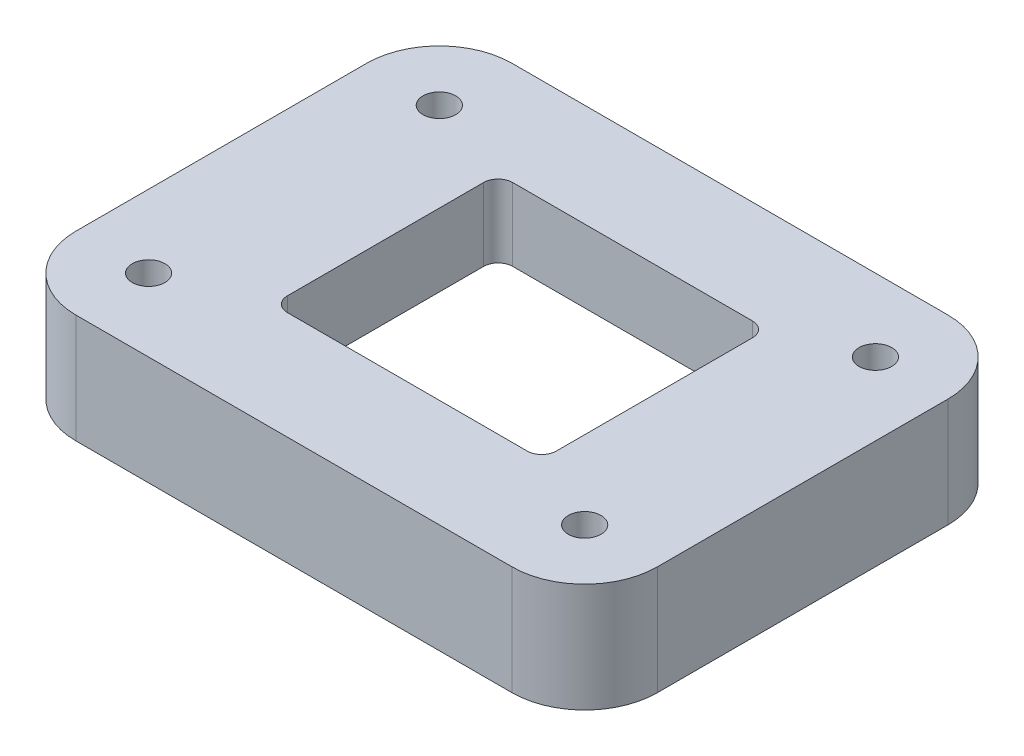
ISO-10303-21;
HEADER;
FILE_DESCRIPTION(('STEP AP214'),'2;1');
FILE_NAME('part.step','',(''),(''),'','','');
FILE_SCHEMA(('AUTOMOTIVE_DESIGN { 1 0 10303 214 1 1 1 1 }'));
ENDSEC;
DATA;
#1=APPLICATION_CONTEXT('core data for automotive mechanical design processes');
#2=APPLICATION_PROTOCOL_DEFINITION('international standard','automotive_design',2000,#1);
#3=PRODUCT_CONTEXT('',#1,'mechanical');
#4=PRODUCT('Part','Part','',(#3));
#5=PRODUCT_RELATED_PRODUCT_CATEGORY('part','',(#4));
#6=PRODUCT_DEFINITION_FORMATION('','',#4);
#7=PRODUCT_DEFINITION_CONTEXT('part definition',#1,'design');
#8=PRODUCT_DEFINITION('design','',#6,#7);
#9=PRODUCT_DEFINITION_SHAPE('','',#8);
#10=(LENGTH_UNIT() NAMED_UNIT(*) SI_UNIT(.MILLI.,.METRE.));
#11=(NAMED_UNIT(*) PLANE_ANGLE_UNIT() SI_UNIT($,.RADIAN.));
#12=(NAMED_UNIT(*) SI_UNIT($,.STERADIAN.) SOLID_ANGLE_UNIT());
#13=UNCERTAINTY_MEASURE_WITH_UNIT(LENGTH_MEASURE(1.E-05),#10,'distance_accuracy_value','');
#14=(GEOMETRIC_REPRESENTATION_CONTEXT(3) GLOBAL_UNCERTAINTY_ASSIGNED_CONTEXT((#13)) GLOBAL_UNIT_ASSIGNED_CONTEXT((#10,
#11,#12)) REPRESENTATION_CONTEXT('',''));
#15=CARTESIAN_POINT('',(0.,0.,0.));
#16=DIRECTION('',(0.,0.,1.));
#17=DIRECTION('',(1.,0.,0.));
#18=AXIS2_PLACEMENT_3D('',#15,#16,#17);
#19=CARTESIAN_POINT('',(10.,15.,50.));
#20=DIRECTION('',(0.,1.,0.));
#21=DIRECTION('',(0.,0.,1.));
#22=AXIS2_PLACEMENT_3D('',#19,#20,#21);
#23=PLANE('',#22);
#24=CARTESIAN_POINT('',(10.,15.,50.));
#25=DIRECTION('',(0.,1.,0.));
#26=DIRECTION('',(0.,0.,1.));
#27=AXIS2_PLACEMENT_3D('',#24,#25,#26);
#28=CIRCLE('',#27,2.25);
#29=CARTESIAN_POINT('',(10.,15.,52.25));
#30=VERTEX_POINT('',#29);
#31=EDGE_CURVE('E391',#30,#30,#28,.T.);
#32=ORIENTED_EDGE('',*,*,#31,.F.);
#33=EDGE_LOOP('',(#32));
#34=FACE_BOUND('',#33,.T.);
#35=CARTESIAN_POINT('',(10.,15.,10.));
#36=DIRECTION('',(0.,1.,0.));
#37=DIRECTION('',(0.,0.,1.));
#38=AXIS2_PLACEMENT_3D('',#35,#36,#37);
#39=CIRCLE('',#38,2.25);
#40=CARTESIAN_POINT('',(10.,15.,12.25));
#41=VERTEX_POINT('',#40);
#42=EDGE_CURVE('E399',#41,#41,#39,.T.);
#43=ORIENTED_EDGE('',*,*,#42,.F.);
#44=EDGE_LOOP('',(#43));
#45=FACE_BOUND('',#44,.T.);
#46=CARTESIAN_POINT('',(10.,15.,50.));
#47=DIRECTION('',(0.,1.,0.));
#48=DIRECTION('',(0.,0.,1.));
#49=AXIS2_PLACEMENT_3D('',#46,#47,#48);
#50=CIRCLE('',#49,10.);
#51=CARTESIAN_POINT('',(0.,15.,49.9999999999999));
#52=VERTEX_POINT('',#51);
#53=CARTESIAN_POINT('',(10.0000000000001,15.,60.));
#54=VERTEX_POINT('',#53);
#55=EDGE_CURVE('E404',#52,#54,#50,.T.);
#56=ORIENTED_EDGE('',*,*,#55,.T.);
#57=DIRECTION('',(1.,0.,0.));
#58=VECTOR('',#57,1.);
#59=CARTESIAN_POINT('',(10.0000000000001,15.,60.));
#60=LINE('',#59,#58);
#61=CARTESIAN_POINT('',(69.9999999999999,15.,60.));
#62=VERTEX_POINT('',#61);
#63=EDGE_CURVE('E408',#54,#62,#60,.T.);
#64=ORIENTED_EDGE('',*,*,#63,.T.);
#65=CARTESIAN_POINT('',(70.,15.,50.));
#66=DIRECTION('',(0.,1.,0.));
#67=DIRECTION('',(0.,0.,-1.));
#68=AXIS2_PLACEMENT_3D('',#65,#66,#67);
#69=CIRCLE('',#68,10.);
#70=CARTESIAN_POINT('',(80.,15.,49.9999999999999));
#71=VERTEX_POINT('',#70);
#72=EDGE_CURVE('E412',#62,#71,#69,.T.);
#73=ORIENTED_EDGE('',*,*,#72,.T.);
#74=DIRECTION('',(0.,0.,-1.));
#75=VECTOR('',#74,1.);
#76=CARTESIAN_POINT('',(80.,15.,10.0000000000001));
#77=LINE('',#76,#75);
#78=CARTESIAN_POINT('',(80.,15.,10.0000000000001));
#79=VERTEX_POINT('',#78);
#80=EDGE_CURVE('E415',#71,#79,#77,.T.);
#81=ORIENTED_EDGE('',*,*,#80,.T.);
#82=CARTESIAN_POINT('',(70.,15.,10.));
#83=DIRECTION('',(0.,1.,0.));
#84=DIRECTION('',(0.,0.,-1.));
#85=AXIS2_PLACEMENT_3D('',#82,#83,#84);
#86=CIRCLE('',#85,10.);
#87=CARTESIAN_POINT('',(69.9999999999999,15.,0.));
#88=VERTEX_POINT('',#87);
#89=EDGE_CURVE('E418',#79,#88,#86,.T.);
#90=ORIENTED_EDGE('',*,*,#89,.T.);
#91=DIRECTION('',(-1.,0.,0.));
#92=VECTOR('',#91,1.);
#93=CARTESIAN_POINT('',(10.0000000000001,15.,0.));
#94=LINE('',#93,#92);
#95=CARTESIAN_POINT('',(10.,15.,0.));
#96=VERTEX_POINT('',#95);
#97=EDGE_CURVE('E421',#88,#96,#94,.T.);
#98=ORIENTED_EDGE('',*,*,#97,.T.);
#99=CARTESIAN_POINT('',(10.,15.,10.));
#100=DIRECTION('',(0.,1.,0.));
#101=DIRECTION('',(0.,0.,-1.));
#102=AXIS2_PLACEMENT_3D('',#99,#100,#101);
#103=CIRCLE('',#102,10.);
#104=CARTESIAN_POINT('',(0.,15.,10.0000000000001));
#105=VERTEX_POINT('',#104);
#106=EDGE_CURVE('E424',#96,#105,#103,.T.);
#107=ORIENTED_EDGE('',*,*,#106,.T.);
#108=DIRECTION('',(0.,0.,1.));
#109=VECTOR('',#108,1.);
#110=CARTESIAN_POINT('',(0.,15.,10.0000000000001));
#111=LINE('',#110,#109);
#112=EDGE_CURVE('E427',#105,#52,#111,.T.);
#113=ORIENTED_EDGE('',*,*,#112,.T.);
#114=EDGE_LOOP('',(#56,#64,#73,#81,#90,#98,#107,#113));
#115=FACE_BOUND('',#114,.T.);
#116=CARTESIAN_POINT('',(70.,15.,10.));
#117=DIRECTION('',(0.,1.,0.));
#118=DIRECTION('',(0.,0.,1.));
#119=AXIS2_PLACEMENT_3D('',#116,#117,#118);
#120=CIRCLE('',#119,2.25);
#121=CARTESIAN_POINT('',(70.,15.,12.25));
#122=VERTEX_POINT('',#121);
#123=EDGE_CURVE('E395',#122,#122,#120,.T.);
#124=ORIENTED_EDGE('',*,*,#123,.F.);
#125=EDGE_LOOP('',(#124));
#126=FACE_BOUND('',#125,.T.);
#127=CARTESIAN_POINT('',(70.,15.,50.));
#128=DIRECTION('',(0.,1.,0.));
#129=DIRECTION('',(0.,0.,1.));
#130=AXIS2_PLACEMENT_3D('',#127,#128,#129);
#131=CIRCLE('',#130,2.25);
#132=CARTESIAN_POINT('',(70.,15.,52.25));
#133=VERTEX_POINT('',#132);
#134=EDGE_CURVE('E387',#133,#133,#131,.T.);
#135=ORIENTED_EDGE('',*,*,#134,.F.);
#136=EDGE_LOOP('',(#135));
#137=FACE_BOUND('',#136,.T.);
#138=DIRECTION('',(1.,0.,0.));
#139=VECTOR('',#138,1.);
#140=CARTESIAN_POINT('',(24.2537650991517,15.,45.1572468888699));
#141=LINE('',#140,#139);
#142=CARTESIAN_POINT('',(24.2537650991517,15.,45.1572468888699));
#143=VERTEX_POINT('',#142);
#144=CARTESIAN_POINT('',(57.2537650991516,15.,45.1572468888699));
#145=VERTEX_POINT('',#144);
#146=EDGE_CURVE('E333',#143,#145,#141,.T.);
#147=ORIENTED_EDGE('',*,*,#146,.F.);
#148=CARTESIAN_POINT('',(24.2537650991517,15.,43.1572468888699));
#149=DIRECTION('',(0.,1.,0.));
#150=DIRECTION('',(0.,0.,-1.));
#151=AXIS2_PLACEMENT_3D('',#148,#149,#150);
#152=CIRCLE('',#151,2.);
#153=CARTESIAN_POINT('',(22.2537650991517,15.,43.1572468888699));
#154=VERTEX_POINT('',#153);
#155=EDGE_CURVE('E330',#154,#143,#152,.T.);
#156=ORIENTED_EDGE('',*,*,#155,.F.);
#157=DIRECTION('',(0.,0.,1.));
#158=VECTOR('',#157,1.);
#159=CARTESIAN_POINT('',(22.2537650991517,15.,16.1572468888699));
#160=LINE('',#159,#158);
#161=CARTESIAN_POINT('',(22.2537650991517,15.,16.1572468888699));
#162=VERTEX_POINT('',#161);
#163=EDGE_CURVE('E352',#162,#154,#160,.T.);
#164=ORIENTED_EDGE('',*,*,#163,.F.);
#165=CARTESIAN_POINT('',(24.2537650991517,15.,16.1572468888699));
#166=DIRECTION('',(0.,1.,0.));
#167=DIRECTION('',(0.,0.,-1.));
#168=AXIS2_PLACEMENT_3D('',#165,#166,#167);
#169=CIRCLE('',#168,2.);
#170=CARTESIAN_POINT('',(24.2537650991517,15.,14.1572468888699));
#171=VERTEX_POINT('',#170);
#172=EDGE_CURVE('E348',#171,#162,#169,.T.);
#173=ORIENTED_EDGE('',*,*,#172,.F.);
#174=DIRECTION('',(-1.,0.,0.));
#175=VECTOR('',#174,1.);
#176=CARTESIAN_POINT('',(24.2537650991517,15.,14.1572468888699));
#177=LINE('',#176,#175);
#178=CARTESIAN_POINT('',(57.2537650991516,15.,14.1572468888699));
#179=VERTEX_POINT('',#178);
#180=EDGE_CURVE('E345',#179,#171,#177,.T.);
#181=ORIENTED_EDGE('',*,*,#180,.F.);
#182=CARTESIAN_POINT('',(57.2537650991517,15.,16.1572468888699));
#183=DIRECTION('',(0.,1.,0.));
#184=DIRECTION('',(0.,0.,1.));
#185=AXIS2_PLACEMENT_3D('',#182,#183,#184);
#186=CIRCLE('',#185,2.);
#187=CARTESIAN_POINT('',(59.2537650991517,15.,16.1572468888699));
#188=VERTEX_POINT('',#187);
#189=EDGE_CURVE('E342',#188,#179,#186,.T.);
#190=ORIENTED_EDGE('',*,*,#189,.F.);
#191=DIRECTION('',(0.,0.,-1.));
#192=VECTOR('',#191,1.);
#193=CARTESIAN_POINT('',(59.2537650991517,15.,16.1572468888699));
#194=LINE('',#193,#192);
#195=CARTESIAN_POINT('',(59.2537650991517,15.,43.1572468888699));
#196=VERTEX_POINT('',#195);
#197=EDGE_CURVE('E339',#196,#188,#194,.T.);
#198=ORIENTED_EDGE('',*,*,#197,.F.);
#199=CARTESIAN_POINT('',(57.2537650991517,15.,43.1572468888699));
#200=DIRECTION('',(0.,1.,0.));
#201=DIRECTION('',(0.,0.,1.));
#202=AXIS2_PLACEMENT_3D('',#199,#200,#201);
#203=CIRCLE('',#202,2.);
#204=EDGE_CURVE('E336',#145,#196,#203,.T.);
#205=ORIENTED_EDGE('',*,*,#204,.F.);
#206=EDGE_LOOP('',(#147,#156,#164,#173,#181,#190,#198,#205));
#207=FACE_BOUND('',#206,.T.);
#208=ADVANCED_FACE('F39',(#34,#45,#115,#126,#137,#207),#23,.T.);
#209=CARTESIAN_POINT('',(10.,0.,50.));
#210=DIRECTION('',(0.,1.,0.));
#211=DIRECTION('',(0.,0.,1.));
#212=AXIS2_PLACEMENT_3D('',#209,#210,#211);
#213=PLANE('',#212);
#214=DIRECTION('',(0.,0.,-1.));
#215=VECTOR('',#214,1.);
#216=CARTESIAN_POINT('',(3.,0.,52.));
#217=LINE('',#216,#215);
#218=CARTESIAN_POINT('',(3.,0.,52.));
#219=VERTEX_POINT('',#218);
#220=CARTESIAN_POINT('',(3.00000000000001,0.,8.));
#221=VERTEX_POINT('',#220);
#222=EDGE_CURVE('E252',#219,#221,#217,.T.);
#223=ORIENTED_EDGE('',*,*,#222,.F.);
#224=CARTESIAN_POINT('',(8.,0.,52.));
#225=DIRECTION('',(0.,-1.,0.));
#226=DIRECTION('',(0.,0.,1.));
#227=AXIS2_PLACEMENT_3D('',#224,#225,#226);
#228=CIRCLE('',#227,5.);
#229=CARTESIAN_POINT('',(8.,0.,57.));
#230=VERTEX_POINT('',#229);
#231=EDGE_CURVE('E55',#230,#219,#228,.T.);
#232=ORIENTED_EDGE('',*,*,#231,.F.);
#233=DIRECTION('',(-1.,0.,0.));
#234=VECTOR('',#233,1.);
#235=CARTESIAN_POINT('',(8.,0.,57.));
#236=LINE('',#235,#234);
#237=CARTESIAN_POINT('',(72.,0.,57.));
#238=VERTEX_POINT('',#237);
#239=EDGE_CURVE('E224',#238,#230,#236,.T.);
#240=ORIENTED_EDGE('',*,*,#239,.F.);
#241=CARTESIAN_POINT('',(72.,0.,52.));
#242=DIRECTION('',(0.,-1.,0.));
#243=DIRECTION('',(0.,0.,-1.));
#244=AXIS2_PLACEMENT_3D('',#241,#242,#243);
#245=CIRCLE('',#244,5.);
#246=CARTESIAN_POINT('',(77.,0.,52.));
#247=VERTEX_POINT('',#246);
#248=EDGE_CURVE('E228',#247,#238,#245,.T.);
#249=ORIENTED_EDGE('',*,*,#248,.F.);
#250=DIRECTION('',(0.,0.,1.));
#251=VECTOR('',#250,1.);
#252=CARTESIAN_POINT('',(77.,0.,52.));
#253=LINE('',#252,#251);
#254=CARTESIAN_POINT('',(77.,0.,8.));
#255=VERTEX_POINT('',#254);
#256=EDGE_CURVE('E267',#255,#247,#253,.T.);
#257=ORIENTED_EDGE('',*,*,#256,.F.);
#258=CARTESIAN_POINT('',(72.,0.,8.));
#259=DIRECTION('',(0.,-1.,0.));
#260=DIRECTION('',(0.,0.,-1.));
#261=AXIS2_PLACEMENT_3D('',#258,#259,#260);
#262=CIRCLE('',#261,5.00000000000001);
#263=CARTESIAN_POINT('',(72.,0.,3.));
#264=VERTEX_POINT('',#263);
#265=EDGE_CURVE('E263',#264,#255,#262,.T.);
#266=ORIENTED_EDGE('',*,*,#265,.F.);
#267=DIRECTION('',(1.,0.,0.));
#268=VECTOR('',#267,1.);
#269=CARTESIAN_POINT('',(8.00000000000001,0.,3.));
#270=LINE('',#269,#268);
#271=CARTESIAN_POINT('',(8.00000000000001,0.,3.));
#272=VERTEX_POINT('',#271);
#273=EDGE_CURVE('E259',#272,#264,#270,.T.);
#274=ORIENTED_EDGE('',*,*,#273,.F.);
#275=CARTESIAN_POINT('',(8.00000000000001,0.,8.));
#276=DIRECTION('',(0.,-1.,0.));
#277=DIRECTION('',(0.,0.,-1.));
#278=AXIS2_PLACEMENT_3D('',#275,#276,#277);
#279=CIRCLE('',#278,5.);
#280=EDGE_CURVE('E255',#221,#272,#279,.T.);
#281=ORIENTED_EDGE('',*,*,#280,.F.);
#282=EDGE_LOOP('',(#223,#232,#240,#249,#257,#266,#274,#281));
#283=FACE_BOUND('',#282,.T.);
#284=CARTESIAN_POINT('',(10.,0.,50.));
#285=DIRECTION('',(0.,1.,0.));
#286=DIRECTION('',(0.,0.,1.));
#287=AXIS2_PLACEMENT_3D('',#284,#285,#286);
#288=CIRCLE('',#287,10.);
#289=CARTESIAN_POINT('',(0.,0.,49.9999999999999));
#290=VERTEX_POINT('',#289);
#291=CARTESIAN_POINT('',(10.0000000000001,0.,60.));
#292=VERTEX_POINT('',#291);
#293=EDGE_CURVE('E403',#290,#292,#288,.T.);
#294=ORIENTED_EDGE('',*,*,#293,.F.);
#295=DIRECTION('',(0.,0.,1.));
#296=VECTOR('',#295,1.);
#297=CARTESIAN_POINT('',(0.,0.,10.0000000000001));
#298=LINE('',#297,#296);
#299=CARTESIAN_POINT('',(0.,0.,10.0000000000001));
#300=VERTEX_POINT('',#299);
#301=EDGE_CURVE('E409',#300,#290,#298,.T.);
#302=ORIENTED_EDGE('',*,*,#301,.F.);
#303=CARTESIAN_POINT('',(10.,0.,10.));
#304=DIRECTION('',(0.,1.,0.));
#305=DIRECTION('',(0.,0.,-1.));
#306=AXIS2_PLACEMENT_3D('',#303,#304,#305);
#307=CIRCLE('',#306,10.);
#308=CARTESIAN_POINT('',(10.,0.,0.));
#309=VERTEX_POINT('',#308);
#310=EDGE_CURVE('E449',#309,#300,#307,.T.);
#311=ORIENTED_EDGE('',*,*,#310,.F.);
#312=DIRECTION('',(-1.,0.,0.));
#313=VECTOR('',#312,1.);
#314=CARTESIAN_POINT('',(10.0000000000001,0.,0.));
#315=LINE('',#314,#313);
#316=CARTESIAN_POINT('',(69.9999999999999,0.,0.));
#317=VERTEX_POINT('',#316);
#318=EDGE_CURVE('E446',#317,#309,#315,.T.);
#319=ORIENTED_EDGE('',*,*,#318,.F.);
#320=CARTESIAN_POINT('',(70.,0.,10.));
#321=DIRECTION('',(0.,1.,0.));
#322=DIRECTION('',(0.,0.,-1.));
#323=AXIS2_PLACEMENT_3D('',#320,#321,#322);
#324=CIRCLE('',#323,10.);
#325=CARTESIAN_POINT('',(80.,0.,10.0000000000001));
#326=VERTEX_POINT('',#325);
#327=EDGE_CURVE('E443',#326,#317,#324,.T.);
#328=ORIENTED_EDGE('',*,*,#327,.F.);
#329=DIRECTION('',(0.,0.,-1.));
#330=VECTOR('',#329,1.);
#331=CARTESIAN_POINT('',(80.,0.,10.0000000000001));
#332=LINE('',#331,#330);
#333=CARTESIAN_POINT('',(80.,0.,49.9999999999999));
#334=VERTEX_POINT('',#333);
#335=EDGE_CURVE('E440',#334,#326,#332,.T.);
#336=ORIENTED_EDGE('',*,*,#335,.F.);
#337=CARTESIAN_POINT('',(70.,0.,50.));
#338=DIRECTION('',(0.,1.,0.));
#339=DIRECTION('',(0.,0.,-1.));
#340=AXIS2_PLACEMENT_3D('',#337,#338,#339);
#341=CIRCLE('',#340,10.);
#342=CARTESIAN_POINT('',(69.9999999999999,0.,60.));
#343=VERTEX_POINT('',#342);
#344=EDGE_CURVE('E437',#343,#334,#341,.T.);
#345=ORIENTED_EDGE('',*,*,#344,.F.);
#346=DIRECTION('',(1.,0.,0.));
#347=VECTOR('',#346,1.);
#348=CARTESIAN_POINT('',(10.0000000000001,0.,60.));
#349=LINE('',#348,#347);
#350=EDGE_CURVE('E434',#292,#343,#349,.T.);
#351=ORIENTED_EDGE('',*,*,#350,.F.);
#352=EDGE_LOOP('',(#294,#302,#311,#319,#328,#336,#345,#351));
#353=FACE_BOUND('',#352,.T.);
#354=ADVANCED_FACE('F492',(#283,#353),#213,.F.);
#355=CARTESIAN_POINT('',(10.,15.,50.));
#356=DIRECTION('',(0.,-1.,0.));
#357=DIRECTION('',(0.,0.,-1.));
#358=AXIS2_PLACEMENT_3D('',#355,#356,#357);
#359=CYLINDRICAL_SURFACE('',#358,10.);
#360=ORIENTED_EDGE('',*,*,#293,.T.);
#361=DIRECTION('',(0.,-1.,0.));
#362=VECTOR('',#361,1.);
#363=CARTESIAN_POINT('',(10.0000000000001,15.,60.));
#364=LINE('',#363,#362);
#365=EDGE_CURVE('E48',#54,#292,#364,.T.);
#366=ORIENTED_EDGE('',*,*,#365,.F.);
#367=ORIENTED_EDGE('',*,*,#55,.F.);
#368=DIRECTION('',(0.,-1.,0.));
#369=VECTOR('',#368,1.);
#370=CARTESIAN_POINT('',(0.,15.,49.9999999999999));
#371=LINE('',#370,#369);
#372=EDGE_CURVE('E430',#52,#290,#371,.T.);
#373=ORIENTED_EDGE('',*,*,#372,.T.);
#374=EDGE_LOOP('',(#360,#366,#367,#373));
#375=FACE_BOUND('',#374,.T.);
#376=ADVANCED_FACE('F41',(#375),#359,.T.);
#377=CARTESIAN_POINT('',(10.0000000000001,15.,60.));
#378=DIRECTION('',(0.,0.,-1.));
#379=DIRECTION('',(-1.,0.,0.));
#380=AXIS2_PLACEMENT_3D('',#377,#378,#379);
#381=PLANE('',#380);
#382=ORIENTED_EDGE('',*,*,#350,.T.);
#383=DIRECTION('',(0.,-1.,0.));
#384=VECTOR('',#383,1.);
#385=CARTESIAN_POINT('',(69.9999999999999,15.,60.));
#386=LINE('',#385,#384);
#387=EDGE_CURVE('E477',#62,#343,#386,.T.);
#388=ORIENTED_EDGE('',*,*,#387,.F.);
#389=ORIENTED_EDGE('',*,*,#63,.F.);
#390=ORIENTED_EDGE('',*,*,#365,.T.);
#391=EDGE_LOOP('',(#382,#388,#389,#390));
#392=FACE_BOUND('',#391,.T.);
#393=ADVANCED_FACE('F484',(#392),#381,.F.);
#394=CARTESIAN_POINT('',(70.,15.,50.));
#395=DIRECTION('',(0.,-1.,0.));
#396=DIRECTION('',(0.,0.,-1.));
#397=AXIS2_PLACEMENT_3D('',#394,#395,#396);
#398=CYLINDRICAL_SURFACE('',#397,10.);
#399=ORIENTED_EDGE('',*,*,#344,.T.);
#400=DIRECTION('',(0.,-1.,0.));
#401=VECTOR('',#400,1.);
#402=CARTESIAN_POINT('',(80.,15.,49.9999999999999));
#403=LINE('',#402,#401);
#404=EDGE_CURVE('E473',#71,#334,#403,.T.);
#405=ORIENTED_EDGE('',*,*,#404,.F.);
#406=ORIENTED_EDGE('',*,*,#72,.F.);
#407=ORIENTED_EDGE('',*,*,#387,.T.);
#408=EDGE_LOOP('',(#399,#405,#406,#407));
#409=FACE_BOUND('',#408,.T.);
#410=ADVANCED_FACE('F499',(#409),#398,.T.);
#411=CARTESIAN_POINT('',(80.,15.,10.0000000000001));
#412=DIRECTION('',(-1.,0.,0.));
#413=DIRECTION('',(0.,0.,1.));
#414=AXIS2_PLACEMENT_3D('',#411,#412,#413);
#415=PLANE('',#414);
#416=ORIENTED_EDGE('',*,*,#335,.T.);
#417=DIRECTION('',(0.,-1.,0.));
#418=VECTOR('',#417,1.);
#419=CARTESIAN_POINT('',(80.,15.,10.0000000000001));
#420=LINE('',#419,#418);
#421=EDGE_CURVE('E469',#79,#326,#420,.T.);
#422=ORIENTED_EDGE('',*,*,#421,.F.);
#423=ORIENTED_EDGE('',*,*,#80,.F.);
#424=ORIENTED_EDGE('',*,*,#404,.T.);
#425=EDGE_LOOP('',(#416,#422,#423,#424));
#426=FACE_BOUND('',#425,.T.);
#427=ADVANCED_FACE('F503',(#426),#415,.F.);
#428=CARTESIAN_POINT('',(70.,15.,10.));
#429=DIRECTION('',(0.,-1.,0.));
#430=DIRECTION('',(0.,0.,-1.));
#431=AXIS2_PLACEMENT_3D('',#428,#429,#430);
#432=CYLINDRICAL_SURFACE('',#431,10.);
#433=ORIENTED_EDGE('',*,*,#327,.T.);
#434=DIRECTION('',(0.,-1.,0.));
#435=VECTOR('',#434,1.);
#436=CARTESIAN_POINT('',(69.9999999999999,15.,0.));
#437=LINE('',#436,#435);
#438=EDGE_CURVE('E465',#88,#317,#437,.T.);
#439=ORIENTED_EDGE('',*,*,#438,.F.);
#440=ORIENTED_EDGE('',*,*,#89,.F.);
#441=ORIENTED_EDGE('',*,*,#421,.T.);
#442=EDGE_LOOP('',(#433,#439,#440,#441));
#443=FACE_BOUND('',#442,.T.);
#444=ADVANCED_FACE('F522',(#443),#432,.T.);
#445=CARTESIAN_POINT('',(10.0000000000001,15.,0.));
#446=DIRECTION('',(0.,0.,1.));
#447=DIRECTION('',(1.,0.,0.));
#448=AXIS2_PLACEMENT_3D('',#445,#446,#447);
#449=PLANE('',#448);
#450=ORIENTED_EDGE('',*,*,#318,.T.);
#451=DIRECTION('',(0.,-1.,0.));
#452=VECTOR('',#451,1.);
#453=CARTESIAN_POINT('',(10.,15.,0.));
#454=LINE('',#453,#452);
#455=EDGE_CURVE('E461',#96,#309,#454,.T.);
#456=ORIENTED_EDGE('',*,*,#455,.F.);
#457=ORIENTED_EDGE('',*,*,#97,.F.);
#458=ORIENTED_EDGE('',*,*,#438,.T.);
#459=EDGE_LOOP('',(#450,#456,#457,#458));
#460=FACE_BOUND('',#459,.T.);
#461=ADVANCED_FACE('F519',(#460),#449,.F.);
#462=CARTESIAN_POINT('',(10.,15.,10.));
#463=DIRECTION('',(0.,-1.,0.));
#464=DIRECTION('',(0.,0.,-1.));
#465=AXIS2_PLACEMENT_3D('',#462,#463,#464);
#466=CYLINDRICAL_SURFACE('',#465,10.);
#467=ORIENTED_EDGE('',*,*,#310,.T.);
#468=DIRECTION('',(0.,-1.,0.));
#469=VECTOR('',#468,1.);
#470=CARTESIAN_POINT('',(0.,15.,10.0000000000001));
#471=LINE('',#470,#469);
#472=EDGE_CURVE('E457',#105,#300,#471,.T.);
#473=ORIENTED_EDGE('',*,*,#472,.F.);
#474=ORIENTED_EDGE('',*,*,#106,.F.);
#475=ORIENTED_EDGE('',*,*,#455,.T.);
#476=EDGE_LOOP('',(#467,#473,#474,#475));
#477=FACE_BOUND('',#476,.T.);
#478=ADVANCED_FACE('F515',(#477),#466,.T.);
#479=CARTESIAN_POINT('',(0.,15.,10.0000000000001));
#480=DIRECTION('',(1.,0.,0.));
#481=DIRECTION('',(0.,0.,-1.));
#482=AXIS2_PLACEMENT_3D('',#479,#480,#481);
#483=PLANE('',#482);
#484=ORIENTED_EDGE('',*,*,#301,.T.);
#485=ORIENTED_EDGE('',*,*,#372,.F.);
#486=ORIENTED_EDGE('',*,*,#112,.F.);
#487=ORIENTED_EDGE('',*,*,#472,.T.);
#488=EDGE_LOOP('',(#484,#485,#486,#487));
#489=FACE_BOUND('',#488,.T.);
#490=ADVANCED_FACE('F513',(#489),#483,.F.);
#491=CARTESIAN_POINT('',(10.,15.,10.));
#492=DIRECTION('',(0.,-1.,0.));
#493=DIRECTION('',(0.,0.,-1.));
#494=AXIS2_PLACEMENT_3D('',#491,#492,#493);
#495=CYLINDRICAL_SURFACE('',#494,2.25);
#496=CARTESIAN_POINT('',(10.,5.,10.));
#497=DIRECTION('',(0.,1.,0.));
#498=DIRECTION('',(0.,0.,1.));
#499=AXIS2_PLACEMENT_3D('',#496,#497,#498);
#500=CIRCLE('',#499,2.25);
#501=CARTESIAN_POINT('',(10.,5.,12.25));
#502=VERTEX_POINT('',#501);
#503=EDGE_CURVE('E326',#502,#502,#500,.T.);
#504=ORIENTED_EDGE('',*,*,#503,.F.);
#505=EDGE_LOOP('',(#504));
#506=FACE_BOUND('',#505,.T.);
#507=ORIENTED_EDGE('',*,*,#42,.T.);
#508=EDGE_LOOP('',(#507));
#509=FACE_BOUND('',#508,.T.);
#510=ADVANCED_FACE('F542',(#506,#509),#495,.F.);
#511=CARTESIAN_POINT('',(70.,15.,10.));
#512=DIRECTION('',(0.,-1.,0.));
#513=DIRECTION('',(0.,0.,-1.));
#514=AXIS2_PLACEMENT_3D('',#511,#512,#513);
#515=CYLINDRICAL_SURFACE('',#514,2.25);
#516=CARTESIAN_POINT('',(70.,5.,10.));
#517=DIRECTION('',(0.,1.,0.));
#518=DIRECTION('',(0.,0.,1.));
#519=AXIS2_PLACEMENT_3D('',#516,#517,#518);
#520=CIRCLE('',#519,2.25);
#521=CARTESIAN_POINT('',(70.,5.,12.25));
#522=VERTEX_POINT('',#521);
#523=EDGE_CURVE('E322',#522,#522,#520,.T.);
#524=ORIENTED_EDGE('',*,*,#523,.F.);
#525=EDGE_LOOP('',(#524));
#526=FACE_BOUND('',#525,.T.);
#527=ORIENTED_EDGE('',*,*,#123,.T.);
#528=EDGE_LOOP('',(#527));
#529=FACE_BOUND('',#528,.T.);
#530=ADVANCED_FACE('F563',(#526,#529),#515,.F.);
#531=CARTESIAN_POINT('',(10.,15.,50.));
#532=DIRECTION('',(0.,-1.,0.));
#533=DIRECTION('',(0.,0.,-1.));
#534=AXIS2_PLACEMENT_3D('',#531,#532,#533);
#535=CYLINDRICAL_SURFACE('',#534,2.25);
#536=CARTESIAN_POINT('',(10.,5.,50.));
#537=DIRECTION('',(0.,1.,0.));
#538=DIRECTION('',(0.,0.,1.));
#539=AXIS2_PLACEMENT_3D('',#536,#537,#538);
#540=CIRCLE('',#539,2.25);
#541=CARTESIAN_POINT('',(10.,5.,52.25));
#542=VERTEX_POINT('',#541);
#543=EDGE_CURVE('E318',#542,#542,#540,.T.);
#544=ORIENTED_EDGE('',*,*,#543,.F.);
#545=EDGE_LOOP('',(#544));
#546=FACE_BOUND('',#545,.T.);
#547=ORIENTED_EDGE('',*,*,#31,.T.);
#548=EDGE_LOOP('',(#547));
#549=FACE_BOUND('',#548,.T.);
#550=ADVANCED_FACE('F570',(#546,#549),#535,.F.);
#551=CARTESIAN_POINT('',(70.,15.,50.));
#552=DIRECTION('',(0.,-1.,0.));
#553=DIRECTION('',(0.,0.,-1.));
#554=AXIS2_PLACEMENT_3D('',#551,#552,#553);
#555=CYLINDRICAL_SURFACE('',#554,2.25);
#556=CARTESIAN_POINT('',(70.,5.,50.));
#557=DIRECTION('',(0.,1.,0.));
#558=DIRECTION('',(0.,0.,1.));
#559=AXIS2_PLACEMENT_3D('',#556,#557,#558);
#560=CIRCLE('',#559,2.25);
#561=CARTESIAN_POINT('',(70.,5.,52.25));
#562=VERTEX_POINT('',#561);
#563=EDGE_CURVE('E314',#562,#562,#560,.T.);
#564=ORIENTED_EDGE('',*,*,#563,.F.);
#565=EDGE_LOOP('',(#564));
#566=FACE_BOUND('',#565,.T.);
#567=ORIENTED_EDGE('',*,*,#134,.T.);
#568=EDGE_LOOP('',(#567));
#569=FACE_BOUND('',#568,.T.);
#570=ADVANCED_FACE('F577',(#566,#569),#555,.F.);
#571=CARTESIAN_POINT('',(24.2537650991517,15.,43.1572468888699));
#572=DIRECTION('',(0.,-1.,0.));
#573=DIRECTION('',(0.,0.,-1.));
#574=AXIS2_PLACEMENT_3D('',#571,#572,#573);
#575=CYLINDRICAL_SURFACE('',#574,2.);
#576=CARTESIAN_POINT('',(24.2537650991517,5.,43.1572468888699));
#577=DIRECTION('',(0.,1.,0.));
#578=DIRECTION('',(0.,0.,1.));
#579=AXIS2_PLACEMENT_3D('',#576,#577,#578);
#580=CIRCLE('',#579,2.);
#581=CARTESIAN_POINT('',(22.2537650991517,5.,43.1572468888699));
#582=VERTEX_POINT('',#581);
#583=CARTESIAN_POINT('',(24.2537650991517,5.,45.1572468888699));
#584=VERTEX_POINT('',#583);
#585=EDGE_CURVE('E311',#582,#584,#580,.T.);
#586=ORIENTED_EDGE('',*,*,#585,.F.);
#587=DIRECTION('',(0.,-1.,0.));
#588=VECTOR('',#587,1.);
#589=CARTESIAN_POINT('',(22.2537650991517,15.,43.1572468888699));
#590=LINE('',#589,#588);
#591=EDGE_CURVE('E355',#154,#582,#590,.T.);
#592=ORIENTED_EDGE('',*,*,#591,.F.);
#593=ORIENTED_EDGE('',*,*,#155,.T.);
#594=DIRECTION('',(0.,-1.,0.));
#595=VECTOR('',#594,1.);
#596=CARTESIAN_POINT('',(24.2537650991517,15.,45.1572468888699));
#597=LINE('',#596,#595);
#598=EDGE_CURVE('E383',#143,#584,#597,.T.);
#599=ORIENTED_EDGE('',*,*,#598,.T.);
#600=EDGE_LOOP('',(#586,#592,#593,#599));
#601=FACE_BOUND('',#600,.T.);
#602=ADVANCED_FACE('F585',(#601),#575,.F.);
#603=CARTESIAN_POINT('',(24.2537650991517,15.,45.1572468888699));
#604=DIRECTION('',(0.,0.,-1.));
#605=DIRECTION('',(-1.,0.,0.));
#606=AXIS2_PLACEMENT_3D('',#603,#604,#605);
#607=PLANE('',#606);
#608=DIRECTION('',(1.,0.,0.));
#609=VECTOR('',#608,1.);
#610=CARTESIAN_POINT('',(24.2537650991517,5.,45.1572468888699));
#611=LINE('',#610,#609);
#612=CARTESIAN_POINT('',(57.2537650991517,5.,45.1572468888699));
#613=VERTEX_POINT('',#612);
#614=EDGE_CURVE('E308',#584,#613,#611,.T.);
#615=ORIENTED_EDGE('',*,*,#614,.F.);
#616=ORIENTED_EDGE('',*,*,#598,.F.);
#617=ORIENTED_EDGE('',*,*,#146,.T.);
#618=DIRECTION('',(0.,-1.,0.));
#619=VECTOR('',#618,1.);
#620=CARTESIAN_POINT('',(57.2537650991516,15.,45.1572468888699));
#621=LINE('',#620,#619);
#622=EDGE_CURVE('E379',#145,#613,#621,.T.);
#623=ORIENTED_EDGE('',*,*,#622,.T.);
#624=EDGE_LOOP('',(#615,#616,#617,#623));
#625=FACE_BOUND('',#624,.T.);
#626=ADVANCED_FACE('F593',(#625),#607,.T.);
#627=CARTESIAN_POINT('',(57.2537650991517,15.,43.1572468888699));
#628=DIRECTION('',(0.,-1.,0.));
#629=DIRECTION('',(0.,0.,-1.));
#630=AXIS2_PLACEMENT_3D('',#627,#628,#629);
#631=CYLINDRICAL_SURFACE('',#630,2.);
#632=CARTESIAN_POINT('',(57.2537650991517,5.,43.1572468888699));
#633=DIRECTION('',(0.,1.,0.));
#634=DIRECTION('',(0.,0.,1.));
#635=AXIS2_PLACEMENT_3D('',#632,#633,#634);
#636=CIRCLE('',#635,2.);
#637=CARTESIAN_POINT('',(59.2537650991517,5.,43.1572468888699));
#638=VERTEX_POINT('',#637);
#639=EDGE_CURVE('E305',#613,#638,#636,.T.);
#640=ORIENTED_EDGE('',*,*,#639,.F.);
#641=ORIENTED_EDGE('',*,*,#622,.F.);
#642=ORIENTED_EDGE('',*,*,#204,.T.);
#643=DIRECTION('',(0.,-1.,0.));
#644=VECTOR('',#643,1.);
#645=CARTESIAN_POINT('',(59.2537650991517,15.,43.1572468888699));
#646=LINE('',#645,#644);
#647=EDGE_CURVE('E375',#196,#638,#646,.T.);
#648=ORIENTED_EDGE('',*,*,#647,.T.);
#649=EDGE_LOOP('',(#640,#641,#642,#648));
#650=FACE_BOUND('',#649,.T.);
#651=ADVANCED_FACE('F601',(#650),#631,.F.);
#652=CARTESIAN_POINT('',(59.2537650991517,15.,16.1572468888699));
#653=DIRECTION('',(-1.,0.,0.));
#654=DIRECTION('',(0.,0.,1.));
#655=AXIS2_PLACEMENT_3D('',#652,#653,#654);
#656=PLANE('',#655);
#657=DIRECTION('',(0.,0.,-1.));
#658=VECTOR('',#657,1.);
#659=CARTESIAN_POINT('',(59.2537650991517,5.,16.1572468888699));
#660=LINE('',#659,#658);
#661=CARTESIAN_POINT('',(59.2537650991517,5.,16.1572468888699));
#662=VERTEX_POINT('',#661);
#663=EDGE_CURVE('E302',#638,#662,#660,.T.);
#664=ORIENTED_EDGE('',*,*,#663,.F.);
#665=ORIENTED_EDGE('',*,*,#647,.F.);
#666=ORIENTED_EDGE('',*,*,#197,.T.);
#667=DIRECTION('',(0.,-1.,0.));
#668=VECTOR('',#667,1.);
#669=CARTESIAN_POINT('',(59.2537650991517,15.,16.1572468888699));
#670=LINE('',#669,#668);
#671=EDGE_CURVE('E371',#188,#662,#670,.T.);
#672=ORIENTED_EDGE('',*,*,#671,.T.);
#673=EDGE_LOOP('',(#664,#665,#666,#672));
#674=FACE_BOUND('',#673,.T.);
#675=ADVANCED_FACE('F609',(#674),#656,.T.);
#676=CARTESIAN_POINT('',(57.2537650991517,15.,16.1572468888699));
#677=DIRECTION('',(0.,-1.,0.));
#678=DIRECTION('',(0.,0.,-1.));
#679=AXIS2_PLACEMENT_3D('',#676,#677,#678);
#680=CYLINDRICAL_SURFACE('',#679,2.);
#681=CARTESIAN_POINT('',(57.2537650991517,5.,16.1572468888699));
#682=DIRECTION('',(0.,1.,0.));
#683=DIRECTION('',(0.,0.,1.));
#684=AXIS2_PLACEMENT_3D('',#681,#682,#683);
#685=CIRCLE('',#684,2.);
#686=CARTESIAN_POINT('',(57.2537650991516,5.,14.1572468888699));
#687=VERTEX_POINT('',#686);
#688=EDGE_CURVE('E299',#662,#687,#685,.T.);
#689=ORIENTED_EDGE('',*,*,#688,.F.);
#690=ORIENTED_EDGE('',*,*,#671,.F.);
#691=ORIENTED_EDGE('',*,*,#189,.T.);
#692=DIRECTION('',(0.,-1.,0.));
#693=VECTOR('',#692,1.);
#694=CARTESIAN_POINT('',(57.2537650991516,15.,14.1572468888699));
#695=LINE('',#694,#693);
#696=EDGE_CURVE('E367',#179,#687,#695,.T.);
#697=ORIENTED_EDGE('',*,*,#696,.T.);
#698=EDGE_LOOP('',(#689,#690,#691,#697));
#699=FACE_BOUND('',#698,.T.);
#700=ADVANCED_FACE('F617',(#699),#680,.F.);
#701=CARTESIAN_POINT('',(24.2537650991517,15.,14.1572468888699));
#702=DIRECTION('',(0.,0.,1.));
#703=DIRECTION('',(1.,0.,0.));
#704=AXIS2_PLACEMENT_3D('',#701,#702,#703);
#705=PLANE('',#704);
#706=DIRECTION('',(-1.,0.,0.));
#707=VECTOR('',#706,1.);
#708=CARTESIAN_POINT('',(24.2537650991517,5.,14.1572468888699));
#709=LINE('',#708,#707);
#710=CARTESIAN_POINT('',(24.2537650991517,5.,14.1572468888699));
#711=VERTEX_POINT('',#710);
#712=EDGE_CURVE('E296',#687,#711,#709,.T.);
#713=ORIENTED_EDGE('',*,*,#712,.F.);
#714=ORIENTED_EDGE('',*,*,#696,.F.);
#715=ORIENTED_EDGE('',*,*,#180,.T.);
#716=DIRECTION('',(0.,-1.,0.));
#717=VECTOR('',#716,1.);
#718=CARTESIAN_POINT('',(24.2537650991517,15.,14.1572468888699));
#719=LINE('',#718,#717);
#720=EDGE_CURVE('E363',#171,#711,#719,.T.);
#721=ORIENTED_EDGE('',*,*,#720,.T.);
#722=EDGE_LOOP('',(#713,#714,#715,#721));
#723=FACE_BOUND('',#722,.T.);
#724=ADVANCED_FACE('F625',(#723),#705,.T.);
#725=CARTESIAN_POINT('',(24.2537650991517,15.,16.1572468888699));
#726=DIRECTION('',(0.,-1.,0.));
#727=DIRECTION('',(0.,0.,-1.));
#728=AXIS2_PLACEMENT_3D('',#725,#726,#727);
#729=CYLINDRICAL_SURFACE('',#728,2.);
#730=CARTESIAN_POINT('',(24.2537650991517,5.,16.1572468888699));
#731=DIRECTION('',(0.,1.,0.));
#732=DIRECTION('',(0.,0.,1.));
#733=AXIS2_PLACEMENT_3D('',#730,#731,#732);
#734=CIRCLE('',#733,2.);
#735=CARTESIAN_POINT('',(22.2537650991517,5.,16.1572468888699));
#736=VERTEX_POINT('',#735);
#737=EDGE_CURVE('E62',#711,#736,#734,.T.);
#738=ORIENTED_EDGE('',*,*,#737,.F.);
#739=ORIENTED_EDGE('',*,*,#720,.F.);
#740=ORIENTED_EDGE('',*,*,#172,.T.);
#741=DIRECTION('',(0.,-1.,0.));
#742=VECTOR('',#741,1.);
#743=CARTESIAN_POINT('',(22.2537650991517,15.,16.1572468888699));
#744=LINE('',#743,#742);
#745=EDGE_CURVE('E359',#162,#736,#744,.T.);
#746=ORIENTED_EDGE('',*,*,#745,.T.);
#747=EDGE_LOOP('',(#738,#739,#740,#746));
#748=FACE_BOUND('',#747,.T.);
#749=ADVANCED_FACE('F633',(#748),#729,.F.);
#750=CARTESIAN_POINT('',(22.2537650991517,15.,16.1572468888699));
#751=DIRECTION('',(1.,0.,0.));
#752=DIRECTION('',(0.,0.,-1.));
#753=AXIS2_PLACEMENT_3D('',#750,#751,#752);
#754=PLANE('',#753);
#755=DIRECTION('',(0.,0.,1.));
#756=VECTOR('',#755,1.);
#757=CARTESIAN_POINT('',(22.2537650991517,5.,16.1572468888699));
#758=LINE('',#757,#756);
#759=EDGE_CURVE('E11',#736,#582,#758,.T.);
#760=ORIENTED_EDGE('',*,*,#759,.F.);
#761=ORIENTED_EDGE('',*,*,#745,.F.);
#762=ORIENTED_EDGE('',*,*,#163,.T.);
#763=ORIENTED_EDGE('',*,*,#591,.T.);
#764=EDGE_LOOP('',(#760,#761,#762,#763));
#765=FACE_BOUND('',#764,.T.);
#766=ADVANCED_FACE('F641',(#765),#754,.T.);
#767=CARTESIAN_POINT('',(8.,5.,52.));
#768=DIRECTION('',(0.,-1.,0.));
#769=DIRECTION('',(0.,0.,-1.));
#770=AXIS2_PLACEMENT_3D('',#767,#768,#769);
#771=CYLINDRICAL_SURFACE('',#770,5.);
#772=ORIENTED_EDGE('',*,*,#231,.T.);
#773=DIRECTION('',(0.,-1.,0.));
#774=VECTOR('',#773,1.);
#775=CARTESIAN_POINT('',(3.,5.,52.));
#776=LINE('',#775,#774);
#777=CARTESIAN_POINT('',(3.,5.,52.));
#778=VERTEX_POINT('',#777);
#779=EDGE_CURVE('E198',#778,#219,#776,.T.);
#780=ORIENTED_EDGE('',*,*,#779,.F.);
#781=CARTESIAN_POINT('',(8.,5.,52.));
#782=DIRECTION('',(0.,-1.,0.));
#783=DIRECTION('',(0.,0.,1.));
#784=AXIS2_PLACEMENT_3D('',#781,#782,#783);
#785=CIRCLE('',#784,5.);
#786=CARTESIAN_POINT('',(8.,5.,57.));
#787=VERTEX_POINT('',#786);
#788=EDGE_CURVE('E202',#787,#778,#785,.T.);
#789=ORIENTED_EDGE('',*,*,#788,.F.);
#790=DIRECTION('',(0.,-1.,0.));
#791=VECTOR('',#790,1.);
#792=CARTESIAN_POINT('',(8.,5.,57.));
#793=LINE('',#792,#791);
#794=EDGE_CURVE('E274',#787,#230,#793,.T.);
#795=ORIENTED_EDGE('',*,*,#794,.T.);
#796=EDGE_LOOP('',(#772,#780,#789,#795));
#797=FACE_BOUND('',#796,.T.);
#798=ADVANCED_FACE('F200',(#797),#771,.F.);
#799=CARTESIAN_POINT('',(8.,5.,57.));
#800=DIRECTION('',(0.,0.,1.));
#801=DIRECTION('',(1.,0.,0.));
#802=AXIS2_PLACEMENT_3D('',#799,#800,#801);
#803=PLANE('',#802);
#804=ORIENTED_EDGE('',*,*,#239,.T.);
#805=ORIENTED_EDGE('',*,*,#794,.F.);
#806=DIRECTION('',(-1.,0.,0.));
#807=VECTOR('',#806,1.);
#808=CARTESIAN_POINT('',(8.,5.,57.));
#809=LINE('',#808,#807);
#810=CARTESIAN_POINT('',(72.,5.,57.));
#811=VERTEX_POINT('',#810);
#812=EDGE_CURVE('E209',#811,#787,#809,.T.);
#813=ORIENTED_EDGE('',*,*,#812,.F.);
#814=DIRECTION('',(0.,-1.,0.));
#815=VECTOR('',#814,1.);
#816=CARTESIAN_POINT('',(72.,5.,57.));
#817=LINE('',#816,#815);
#818=EDGE_CURVE('E277',#811,#238,#817,.T.);
#819=ORIENTED_EDGE('',*,*,#818,.T.);
#820=EDGE_LOOP('',(#804,#805,#813,#819));
#821=FACE_BOUND('',#820,.T.);
#822=ADVANCED_FACE('F656',(#821),#803,.F.);
#823=CARTESIAN_POINT('',(72.,5.,52.));
#824=DIRECTION('',(0.,-1.,0.));
#825=DIRECTION('',(0.,0.,-1.));
#826=AXIS2_PLACEMENT_3D('',#823,#824,#825);
#827=CYLINDRICAL_SURFACE('',#826,5.);
#828=ORIENTED_EDGE('',*,*,#248,.T.);
#829=ORIENTED_EDGE('',*,*,#818,.F.);
#830=CARTESIAN_POINT('',(72.,5.,52.));
#831=DIRECTION('',(0.,-1.,0.));
#832=DIRECTION('',(0.,0.,-1.));
#833=AXIS2_PLACEMENT_3D('',#830,#831,#832);
#834=CIRCLE('',#833,5.);
#835=CARTESIAN_POINT('',(77.,5.,52.));
#836=VERTEX_POINT('',#835);
#837=EDGE_CURVE('E245',#836,#811,#834,.T.);
#838=ORIENTED_EDGE('',*,*,#837,.F.);
#839=DIRECTION('',(0.,-1.,0.));
#840=VECTOR('',#839,1.);
#841=CARTESIAN_POINT('',(77.,5.,52.));
#842=LINE('',#841,#840);
#843=EDGE_CURVE('E280',#836,#247,#842,.T.);
#844=ORIENTED_EDGE('',*,*,#843,.T.);
#845=EDGE_LOOP('',(#828,#829,#838,#844));
#846=FACE_BOUND('',#845,.T.);
#847=ADVANCED_FACE('F663',(#846),#827,.F.);
#848=CARTESIAN_POINT('',(77.,5.,52.));
#849=DIRECTION('',(1.,0.,0.));
#850=DIRECTION('',(0.,0.,-1.));
#851=AXIS2_PLACEMENT_3D('',#848,#849,#850);
#852=PLANE('',#851);
#853=ORIENTED_EDGE('',*,*,#256,.T.);
#854=ORIENTED_EDGE('',*,*,#843,.F.);
#855=DIRECTION('',(0.,0.,1.));
#856=VECTOR('',#855,1.);
#857=CARTESIAN_POINT('',(77.,5.,52.));
#858=LINE('',#857,#856);
#859=CARTESIAN_POINT('',(77.,5.,8.));
#860=VERTEX_POINT('',#859);
#861=EDGE_CURVE('E241',#860,#836,#858,.T.);
#862=ORIENTED_EDGE('',*,*,#861,.F.);
#863=DIRECTION('',(0.,-1.,0.));
#864=VECTOR('',#863,1.);
#865=CARTESIAN_POINT('',(77.,5.,8.));
#866=LINE('',#865,#864);
#867=EDGE_CURVE('E283',#860,#255,#866,.T.);
#868=ORIENTED_EDGE('',*,*,#867,.T.);
#869=EDGE_LOOP('',(#853,#854,#862,#868));
#870=FACE_BOUND('',#869,.T.);
#871=ADVANCED_FACE('F671',(#870),#852,.F.);
#872=CARTESIAN_POINT('',(72.,5.,8.));
#873=DIRECTION('',(0.,-1.,0.));
#874=DIRECTION('',(0.,0.,-1.));
#875=AXIS2_PLACEMENT_3D('',#872,#873,#874);
#876=CYLINDRICAL_SURFACE('',#875,5.00000000000001);
#877=ORIENTED_EDGE('',*,*,#265,.T.);
#878=ORIENTED_EDGE('',*,*,#867,.F.);
#879=CARTESIAN_POINT('',(72.,5.,8.));
#880=DIRECTION('',(0.,-1.,0.));
#881=DIRECTION('',(0.,0.,-1.));
#882=AXIS2_PLACEMENT_3D('',#879,#880,#881);
#883=CIRCLE('',#882,5.00000000000001);
#884=CARTESIAN_POINT('',(72.,5.,3.));
#885=VERTEX_POINT('',#884);
#886=EDGE_CURVE('E237',#885,#860,#883,.T.);
#887=ORIENTED_EDGE('',*,*,#886,.F.);
#888=DIRECTION('',(0.,-1.,0.));
#889=VECTOR('',#888,1.);
#890=CARTESIAN_POINT('',(72.,5.,3.));
#891=LINE('',#890,#889);
#892=EDGE_CURVE('E286',#885,#264,#891,.T.);
#893=ORIENTED_EDGE('',*,*,#892,.T.);
#894=EDGE_LOOP('',(#877,#878,#887,#893));
#895=FACE_BOUND('',#894,.T.);
#896=ADVANCED_FACE('F679',(#895),#876,.F.);
#897=CARTESIAN_POINT('',(8.00000000000001,5.,3.));
#898=DIRECTION('',(0.,0.,-1.));
#899=DIRECTION('',(-1.,0.,0.));
#900=AXIS2_PLACEMENT_3D('',#897,#898,#899);
#901=PLANE('',#900);
#902=ORIENTED_EDGE('',*,*,#273,.T.);
#903=ORIENTED_EDGE('',*,*,#892,.F.);
#904=DIRECTION('',(1.,0.,0.));
#905=VECTOR('',#904,1.);
#906=CARTESIAN_POINT('',(8.00000000000001,5.,3.));
#907=LINE('',#906,#905);
#908=CARTESIAN_POINT('',(8.00000000000001,5.,3.));
#909=VERTEX_POINT('',#908);
#910=EDGE_CURVE('E233',#909,#885,#907,.T.);
#911=ORIENTED_EDGE('',*,*,#910,.F.);
#912=DIRECTION('',(0.,-1.,0.));
#913=VECTOR('',#912,1.);
#914=CARTESIAN_POINT('',(8.00000000000001,5.,3.));
#915=LINE('',#914,#913);
#916=EDGE_CURVE('E289',#909,#272,#915,.T.);
#917=ORIENTED_EDGE('',*,*,#916,.T.);
#918=EDGE_LOOP('',(#902,#903,#911,#917));
#919=FACE_BOUND('',#918,.T.);
#920=ADVANCED_FACE('F687',(#919),#901,.F.);
#921=CARTESIAN_POINT('',(8.00000000000001,5.,8.));
#922=DIRECTION('',(0.,-1.,0.));
#923=DIRECTION('',(0.,0.,-1.));
#924=AXIS2_PLACEMENT_3D('',#921,#922,#923);
#925=CYLINDRICAL_SURFACE('',#924,5.);
#926=ORIENTED_EDGE('',*,*,#280,.T.);
#927=ORIENTED_EDGE('',*,*,#916,.F.);
#928=CARTESIAN_POINT('',(8.00000000000001,5.,8.));
#929=DIRECTION('',(0.,-1.,0.));
#930=DIRECTION('',(0.,0.,-1.));
#931=AXIS2_PLACEMENT_3D('',#928,#929,#930);
#932=CIRCLE('',#931,5.);
#933=CARTESIAN_POINT('',(3.00000000000001,5.,8.));
#934=VERTEX_POINT('',#933);
#935=EDGE_CURVE('E218',#934,#909,#932,.T.);
#936=ORIENTED_EDGE('',*,*,#935,.F.);
#937=DIRECTION('',(0.,-1.,0.));
#938=VECTOR('',#937,1.);
#939=CARTESIAN_POINT('',(3.00000000000001,5.,8.));
#940=LINE('',#939,#938);
#941=EDGE_CURVE('E208',#934,#221,#940,.T.);
#942=ORIENTED_EDGE('',*,*,#941,.T.);
#943=EDGE_LOOP('',(#926,#927,#936,#942));
#944=FACE_BOUND('',#943,.T.);
#945=ADVANCED_FACE('F695',(#944),#925,.F.);
#946=CARTESIAN_POINT('',(3.,5.,52.));
#947=DIRECTION('',(-1.,0.,0.));
#948=DIRECTION('',(0.,0.,1.));
#949=AXIS2_PLACEMENT_3D('',#946,#947,#948);
#950=PLANE('',#949);
#951=ORIENTED_EDGE('',*,*,#222,.T.);
#952=ORIENTED_EDGE('',*,*,#941,.F.);
#953=DIRECTION('',(0.,0.,-1.));
#954=VECTOR('',#953,1.);
#955=CARTESIAN_POINT('',(3.,5.,52.));
#956=LINE('',#955,#954);
#957=EDGE_CURVE('E212',#778,#934,#956,.T.);
#958=ORIENTED_EDGE('',*,*,#957,.F.);
#959=ORIENTED_EDGE('',*,*,#779,.T.);
#960=EDGE_LOOP('',(#951,#952,#958,#959));
#961=FACE_BOUND('',#960,.T.);
#962=ADVANCED_FACE('F213',(#961),#950,.F.);
#963=CARTESIAN_POINT('',(8.,5.,52.));
#964=DIRECTION('',(0.,1.,0.));
#965=DIRECTION('',(0.,0.,1.));
#966=AXIS2_PLACEMENT_3D('',#963,#964,#965);
#967=PLANE('',#966);
#968=ORIENTED_EDGE('',*,*,#503,.T.);
#969=EDGE_LOOP('',(#968));
#970=FACE_BOUND('',#969,.T.);
#971=ORIENTED_EDGE('',*,*,#523,.T.);
#972=EDGE_LOOP('',(#971));
#973=FACE_BOUND('',#972,.T.);
#974=ORIENTED_EDGE('',*,*,#543,.T.);
#975=EDGE_LOOP('',(#974));
#976=FACE_BOUND('',#975,.T.);
#977=ORIENTED_EDGE('',*,*,#563,.T.);
#978=EDGE_LOOP('',(#977));
#979=FACE_BOUND('',#978,.T.);
#980=ORIENTED_EDGE('',*,*,#585,.T.);
#981=ORIENTED_EDGE('',*,*,#614,.T.);
#982=ORIENTED_EDGE('',*,*,#639,.T.);
#983=ORIENTED_EDGE('',*,*,#663,.T.);
#984=ORIENTED_EDGE('',*,*,#688,.T.);
#985=ORIENTED_EDGE('',*,*,#712,.T.);
#986=ORIENTED_EDGE('',*,*,#737,.T.);
#987=ORIENTED_EDGE('',*,*,#759,.T.);
#988=EDGE_LOOP('',(#980,#981,#982,#983,#984,#985,#986,#987));
#989=FACE_BOUND('',#988,.T.);
#990=ORIENTED_EDGE('',*,*,#788,.T.);
#991=ORIENTED_EDGE('',*,*,#957,.T.);
#992=ORIENTED_EDGE('',*,*,#935,.T.);
#993=ORIENTED_EDGE('',*,*,#910,.T.);
#994=ORIENTED_EDGE('',*,*,#886,.T.);
#995=ORIENTED_EDGE('',*,*,#861,.T.);
#996=ORIENTED_EDGE('',*,*,#837,.T.);
#997=ORIENTED_EDGE('',*,*,#812,.T.);
#998=EDGE_LOOP('',(#990,#991,#992,#993,#994,#995,#996,#997));
#999=FACE_BOUND('',#998,.T.);
#1000=ADVANCED_FACE('F220',(#970,#973,#976,#979,#989,#999),#967,.F.);
#1001=CLOSED_SHELL('',(#208,#354,#376,#393,#410,#427,#444,#461,#478,#490,#510,#530,#550,#570,
#602,#626,#651,#675,#700,#724,#749,#766,#798,#822,#847,#871,#896,#920,#945,#962,#1000));
#1002=MANIFOLD_SOLID_BREP('B2',#1001);
#1003=ADVANCED_BREP_SHAPE_REPRESENTATION('',(#18,#1002),#14);
#1004=SHAPE_DEFINITION_REPRESENTATION(#9,#1003);
ENDSEC;
END-ISO-10303-21;
